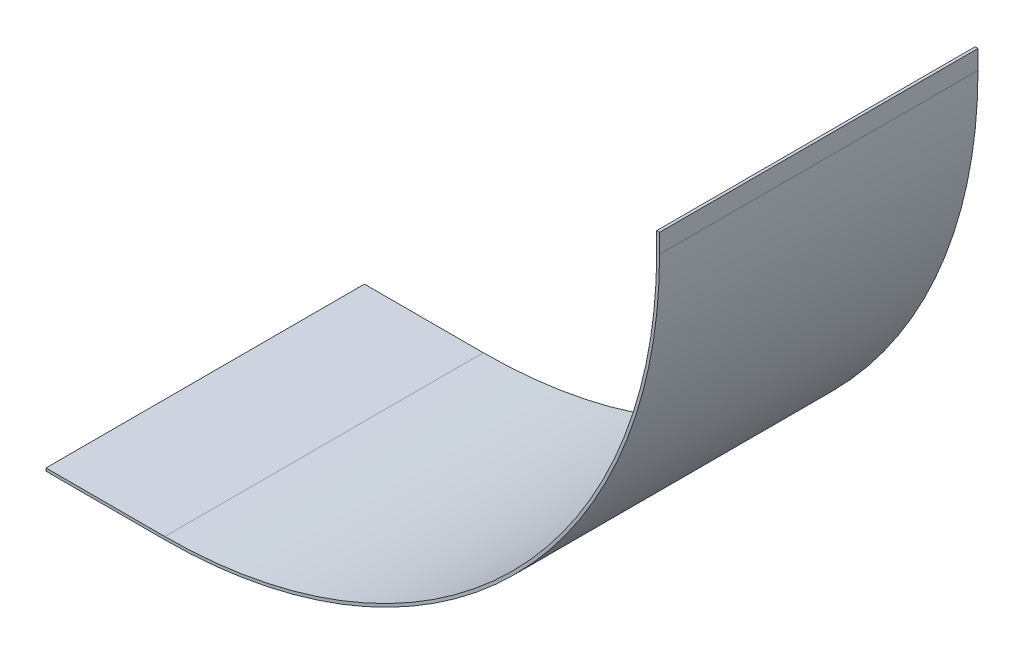
ISO-10303-21;
HEADER;
FILE_DESCRIPTION(('STEP AP214'),'2;1');
FILE_NAME('part.step','',(''),(''),'','','');
FILE_SCHEMA(('AUTOMOTIVE_DESIGN { 1 0 10303 214 1 1 1 1 }'));
ENDSEC;
DATA;
#1=APPLICATION_CONTEXT('core data for automotive mechanical design processes');
#2=APPLICATION_PROTOCOL_DEFINITION('international standard','automotive_design',2000,#1);
#3=PRODUCT_CONTEXT('',#1,'mechanical');
#4=PRODUCT('Part','Part','',(#3));
#5=PRODUCT_RELATED_PRODUCT_CATEGORY('part','',(#4));
#6=PRODUCT_DEFINITION_FORMATION('','',#4);
#7=PRODUCT_DEFINITION_CONTEXT('part definition',#1,'design');
#8=PRODUCT_DEFINITION('design','',#6,#7);
#9=PRODUCT_DEFINITION_SHAPE('','',#8);
#10=(LENGTH_UNIT() NAMED_UNIT(*) SI_UNIT(.MILLI.,.METRE.));
#11=(NAMED_UNIT(*) PLANE_ANGLE_UNIT() SI_UNIT($,.RADIAN.));
#12=(NAMED_UNIT(*) SI_UNIT($,.STERADIAN.) SOLID_ANGLE_UNIT());
#13=UNCERTAINTY_MEASURE_WITH_UNIT(LENGTH_MEASURE(1.E-05),#10,'distance_accuracy_value','');
#14=(GEOMETRIC_REPRESENTATION_CONTEXT(3) GLOBAL_UNCERTAINTY_ASSIGNED_CONTEXT((#13)) GLOBAL_UNIT_ASSIGNED_CONTEXT((#10,
#11,#12)) REPRESENTATION_CONTEXT('',''));
#15=CARTESIAN_POINT('',(0.,0.,0.));
#16=DIRECTION('',(0.,0.,1.));
#17=DIRECTION('',(1.,0.,0.));
#18=AXIS2_PLACEMENT_3D('',#15,#16,#17);
#19=CARTESIAN_POINT('',(1200.,-5485.,-670.));
#20=DIRECTION('',(0.,1.,0.));
#21=DIRECTION('',(0.,0.,1.));
#22=AXIS2_PLACEMENT_3D('',#19,#20,#21);
#23=PLANE('',#22);
#24=DIRECTION('',(-1.,0.,0.));
#25=VECTOR('',#24,1.);
#26=CARTESIAN_POINT('',(1200.,-5485.,0.));
#27=LINE('',#26,#25);
#28=CARTESIAN_POINT('',(1200.,-5485.,0.));
#29=VERTEX_POINT('',#28);
#30=CARTESIAN_POINT('',(950.000000000001,-5485.,0.));
#31=VERTEX_POINT('',#30);
#32=EDGE_CURVE('E132',#29,#31,#27,.T.);
#33=ORIENTED_EDGE('',*,*,#32,.F.);
#34=DIRECTION('',(0.,0.,1.));
#35=VECTOR('',#34,1.);
#36=CARTESIAN_POINT('',(1200.,-5485.,-670.));
#37=LINE('',#36,#35);
#38=CARTESIAN_POINT('',(1200.,-5485.,-670.));
#39=VERTEX_POINT('',#38);
#40=EDGE_CURVE('E11',#39,#29,#37,.T.);
#41=ORIENTED_EDGE('',*,*,#40,.F.);
#42=DIRECTION('',(-1.,0.,0.));
#43=VECTOR('',#42,1.);
#44=CARTESIAN_POINT('',(1200.,-5485.,-670.));
#45=LINE('',#44,#43);
#46=CARTESIAN_POINT('',(950.000000000001,-5485.,-670.));
#47=VERTEX_POINT('',#46);
#48=EDGE_CURVE('E149',#39,#47,#45,.T.);
#49=ORIENTED_EDGE('',*,*,#48,.T.);
#50=DIRECTION('',(0.,0.,1.));
#51=VECTOR('',#50,1.);
#52=CARTESIAN_POINT('',(950.000000000001,-5485.,-670.));
#53=LINE('',#52,#51);
#54=EDGE_CURVE('E42',#47,#31,#53,.T.);
#55=ORIENTED_EDGE('',*,*,#54,.T.);
#56=EDGE_LOOP('',(#33,#41,#49,#55));
#57=FACE_BOUND('',#56,.T.);
#58=ADVANCED_FACE('F39',(#57),#23,.T.);
#59=CARTESIAN_POINT('',(1200.,-4450.,-670.));
#60=DIRECTION('',(0.,0.,1.));
#61=DIRECTION('',(1.,0.,0.));
#62=AXIS2_PLACEMENT_3D('',#59,#60,#61);
#63=CYLINDRICAL_SURFACE('',#62,1035.);
#64=CARTESIAN_POINT('',(1200.,-4450.,0.));
#65=DIRECTION('',(0.,0.,-1.));
#66=DIRECTION('',(1.,0.,0.));
#67=AXIS2_PLACEMENT_3D('',#64,#65,#66);
#68=CIRCLE('',#67,1035.);
#69=CARTESIAN_POINT('',(2235.,-4450.,0.));
#70=VERTEX_POINT('',#69);
#71=EDGE_CURVE('E147',#70,#29,#68,.T.);
#72=ORIENTED_EDGE('',*,*,#71,.F.);
#73=DIRECTION('',(0.,0.,1.));
#74=VECTOR('',#73,1.);
#75=CARTESIAN_POINT('',(2235.,-4450.,-670.));
#76=LINE('',#75,#74);
#77=CARTESIAN_POINT('',(2235.,-4450.,-670.));
#78=VERTEX_POINT('',#77);
#79=EDGE_CURVE('E48',#78,#70,#76,.T.);
#80=ORIENTED_EDGE('',*,*,#79,.F.);
#81=CARTESIAN_POINT('',(1200.,-4450.,-670.));
#82=DIRECTION('',(0.,0.,-1.));
#83=DIRECTION('',(1.,0.,0.));
#84=AXIS2_PLACEMENT_3D('',#81,#82,#83);
#85=CIRCLE('',#84,1035.);
#86=EDGE_CURVE('E127',#78,#39,#85,.T.);
#87=ORIENTED_EDGE('',*,*,#86,.T.);
#88=ORIENTED_EDGE('',*,*,#40,.T.);
#89=EDGE_LOOP('',(#72,#80,#87,#88));
#90=FACE_BOUND('',#89,.T.);
#91=ADVANCED_FACE('F167',(#90),#63,.F.);
#92=CARTESIAN_POINT('',(2235.,-4410.,-670.));
#93=DIRECTION('',(-1.,0.,0.));
#94=DIRECTION('',(0.,0.,1.));
#95=AXIS2_PLACEMENT_3D('',#92,#93,#94);
#96=PLANE('',#95);
#97=DIRECTION('',(0.,-1.,0.));
#98=VECTOR('',#97,1.);
#99=CARTESIAN_POINT('',(2235.,-4410.,0.));
#100=LINE('',#99,#98);
#101=CARTESIAN_POINT('',(2235.,-4410.,0.));
#102=VERTEX_POINT('',#101);
#103=EDGE_CURVE('E114',#102,#70,#100,.T.);
#104=ORIENTED_EDGE('',*,*,#103,.F.);
#105=DIRECTION('',(0.,0.,1.));
#106=VECTOR('',#105,1.);
#107=CARTESIAN_POINT('',(2235.,-4410.,-670.));
#108=LINE('',#107,#106);
#109=CARTESIAN_POINT('',(2235.,-4410.,-670.));
#110=VERTEX_POINT('',#109);
#111=EDGE_CURVE('E108',#110,#102,#108,.T.);
#112=ORIENTED_EDGE('',*,*,#111,.F.);
#113=DIRECTION('',(0.,-1.,0.));
#114=VECTOR('',#113,1.);
#115=CARTESIAN_POINT('',(2235.,-4410.,-670.));
#116=LINE('',#115,#114);
#117=EDGE_CURVE('E112',#110,#78,#116,.T.);
#118=ORIENTED_EDGE('',*,*,#117,.T.);
#119=ORIENTED_EDGE('',*,*,#79,.T.);
#120=EDGE_LOOP('',(#104,#112,#118,#119));
#121=FACE_BOUND('',#120,.T.);
#122=ADVANCED_FACE('F110',(#121),#96,.T.);
#123=CARTESIAN_POINT('',(2235.,-4410.,-670.));
#124=DIRECTION('',(0.,-1.,0.));
#125=DIRECTION('',(0.,0.,-1.));
#126=AXIS2_PLACEMENT_3D('',#123,#124,#125);
#127=PLANE('',#126);
#128=DIRECTION('',(1.,0.,0.));
#129=VECTOR('',#128,1.);
#130=CARTESIAN_POINT('',(2235.,-4410.,0.));
#131=LINE('',#130,#129);
#132=CARTESIAN_POINT('',(2241.,-4410.,0.));
#133=VERTEX_POINT('',#132);
#134=EDGE_CURVE('E144',#102,#133,#131,.T.);
#135=ORIENTED_EDGE('',*,*,#134,.T.);
#136=DIRECTION('',(0.,0.,1.));
#137=VECTOR('',#136,1.);
#138=CARTESIAN_POINT('',(2241.,-4410.,-670.));
#139=LINE('',#138,#137);
#140=CARTESIAN_POINT('',(2241.,-4410.,-670.));
#141=VERTEX_POINT('',#140);
#142=EDGE_CURVE('E117',#141,#133,#139,.T.);
#143=ORIENTED_EDGE('',*,*,#142,.F.);
#144=DIRECTION('',(1.,0.,0.));
#145=VECTOR('',#144,1.);
#146=CARTESIAN_POINT('',(2235.,-4410.,-670.));
#147=LINE('',#146,#145);
#148=EDGE_CURVE('E120',#110,#141,#147,.T.);
#149=ORIENTED_EDGE('',*,*,#148,.F.);
#150=ORIENTED_EDGE('',*,*,#111,.T.);
#151=EDGE_LOOP('',(#135,#143,#149,#150));
#152=FACE_BOUND('',#151,.T.);
#153=ADVANCED_FACE('F121',(#152),#127,.F.);
#154=CARTESIAN_POINT('',(2241.,-4410.,-670.));
#155=DIRECTION('',(-1.,0.,0.));
#156=DIRECTION('',(0.,0.,1.));
#157=AXIS2_PLACEMENT_3D('',#154,#155,#156);
#158=PLANE('',#157);
#159=DIRECTION('',(0.,1.,0.));
#160=VECTOR('',#159,1.);
#161=CARTESIAN_POINT('',(2241.,-4410.,0.));
#162=LINE('',#161,#160);
#163=CARTESIAN_POINT('',(2241.,-4450.,0.));
#164=VERTEX_POINT('',#163);
#165=EDGE_CURVE('E142',#133,#164,#162,.F.);
#166=ORIENTED_EDGE('',*,*,#165,.T.);
#167=DIRECTION('',(0.,0.,1.));
#168=VECTOR('',#167,1.);
#169=CARTESIAN_POINT('',(2241.,-4450.,-670.));
#170=LINE('',#169,#168);
#171=CARTESIAN_POINT('',(2241.,-4450.,-670.));
#172=VERTEX_POINT('',#171);
#173=EDGE_CURVE('E153',#172,#164,#170,.T.);
#174=ORIENTED_EDGE('',*,*,#173,.F.);
#175=DIRECTION('',(0.,1.,0.));
#176=VECTOR('',#175,1.);
#177=CARTESIAN_POINT('',(2241.,-4410.,-670.));
#178=LINE('',#177,#176);
#179=EDGE_CURVE('E124',#141,#172,#178,.F.);
#180=ORIENTED_EDGE('',*,*,#179,.F.);
#181=ORIENTED_EDGE('',*,*,#142,.T.);
#182=EDGE_LOOP('',(#166,#174,#180,#181));
#183=FACE_BOUND('',#182,.T.);
#184=ADVANCED_FACE('F180',(#183),#158,.F.);
#185=CARTESIAN_POINT('',(1200.,-4450.,-670.));
#186=DIRECTION('',(0.,0.,1.));
#187=DIRECTION('',(1.,0.,0.));
#188=AXIS2_PLACEMENT_3D('',#185,#186,#187);
#189=CYLINDRICAL_SURFACE('',#188,1041.);
#190=CARTESIAN_POINT('',(1200.,-4450.,0.));
#191=DIRECTION('',(0.,0.,1.));
#192=DIRECTION('',(1.,0.,0.));
#193=AXIS2_PLACEMENT_3D('',#190,#191,#192);
#194=CIRCLE('',#193,1041.);
#195=CARTESIAN_POINT('',(1200.,-5491.,0.));
#196=VERTEX_POINT('',#195);
#197=EDGE_CURVE('E140',#164,#196,#194,.F.);
#198=ORIENTED_EDGE('',*,*,#197,.T.);
#199=DIRECTION('',(0.,0.,1.));
#200=VECTOR('',#199,1.);
#201=CARTESIAN_POINT('',(1200.,-5491.,-670.));
#202=LINE('',#201,#200);
#203=CARTESIAN_POINT('',(1200.,-5491.,-670.));
#204=VERTEX_POINT('',#203);
#205=EDGE_CURVE('E156',#204,#196,#202,.T.);
#206=ORIENTED_EDGE('',*,*,#205,.F.);
#207=CARTESIAN_POINT('',(1200.,-4450.,-670.));
#208=DIRECTION('',(0.,0.,1.));
#209=DIRECTION('',(1.,0.,0.));
#210=AXIS2_PLACEMENT_3D('',#207,#208,#209);
#211=CIRCLE('',#210,1041.);
#212=EDGE_CURVE('E258',#172,#204,#211,.F.);
#213=ORIENTED_EDGE('',*,*,#212,.F.);
#214=ORIENTED_EDGE('',*,*,#173,.T.);
#215=EDGE_LOOP('',(#198,#206,#213,#214));
#216=FACE_BOUND('',#215,.T.);
#217=ADVANCED_FACE('F183',(#216),#189,.T.);
#218=CARTESIAN_POINT('',(1200.,-5491.,-670.));
#219=DIRECTION('',(0.,1.,0.));
#220=DIRECTION('',(0.,0.,1.));
#221=AXIS2_PLACEMENT_3D('',#218,#219,#220);
#222=PLANE('',#221);
#223=DIRECTION('',(1.,0.,0.));
#224=VECTOR('',#223,1.);
#225=CARTESIAN_POINT('',(1200.,-5491.,0.));
#226=LINE('',#225,#224);
#227=CARTESIAN_POINT('',(950.000000000001,-5491.,0.));
#228=VERTEX_POINT('',#227);
#229=EDGE_CURVE('E138',#196,#228,#226,.F.);
#230=ORIENTED_EDGE('',*,*,#229,.T.);
#231=DIRECTION('',(0.,0.,1.));
#232=VECTOR('',#231,1.);
#233=CARTESIAN_POINT('',(950.000000000001,-5491.,-670.));
#234=LINE('',#233,#232);
#235=CARTESIAN_POINT('',(950.000000000001,-5491.,-670.));
#236=VERTEX_POINT('',#235);
#237=EDGE_CURVE('E158',#236,#228,#234,.T.);
#238=ORIENTED_EDGE('',*,*,#237,.F.);
#239=DIRECTION('',(1.,0.,0.));
#240=VECTOR('',#239,1.);
#241=CARTESIAN_POINT('',(1200.,-5491.,-670.));
#242=LINE('',#241,#240);
#243=EDGE_CURVE('E259',#204,#236,#242,.F.);
#244=ORIENTED_EDGE('',*,*,#243,.F.);
#245=ORIENTED_EDGE('',*,*,#205,.T.);
#246=EDGE_LOOP('',(#230,#238,#244,#245));
#247=FACE_BOUND('',#246,.T.);
#248=ADVANCED_FACE('F187',(#247),#222,.F.);
#249=CARTESIAN_POINT('',(950.000000000001,-5491.,-670.));
#250=DIRECTION('',(1.,0.,0.));
#251=DIRECTION('',(0.,0.,-1.));
#252=AXIS2_PLACEMENT_3D('',#249,#250,#251);
#253=PLANE('',#252);
#254=DIRECTION('',(0.,1.,0.));
#255=VECTOR('',#254,1.);
#256=CARTESIAN_POINT('',(950.000000000001,-5491.,0.));
#257=LINE('',#256,#255);
#258=EDGE_CURVE('E135',#228,#31,#257,.T.);
#259=ORIENTED_EDGE('',*,*,#258,.T.);
#260=ORIENTED_EDGE('',*,*,#54,.F.);
#261=DIRECTION('',(0.,1.,0.));
#262=VECTOR('',#261,1.);
#263=CARTESIAN_POINT('',(950.000000000001,-5491.,-670.));
#264=LINE('',#263,#262);
#265=EDGE_CURVE('E95',#236,#47,#264,.T.);
#266=ORIENTED_EDGE('',*,*,#265,.F.);
#267=ORIENTED_EDGE('',*,*,#237,.T.);
#268=EDGE_LOOP('',(#259,#260,#266,#267));
#269=FACE_BOUND('',#268,.T.);
#270=ADVANCED_FACE('F163',(#269),#253,.F.);
#271=CARTESIAN_POINT('',(1200.,-4450.,-670.));
#272=DIRECTION('',(0.,0.,1.));
#273=DIRECTION('',(1.,0.,0.));
#274=AXIS2_PLACEMENT_3D('',#271,#272,#273);
#275=PLANE('',#274);
#276=ORIENTED_EDGE('',*,*,#48,.F.);
#277=ORIENTED_EDGE('',*,*,#86,.F.);
#278=ORIENTED_EDGE('',*,*,#117,.F.);
#279=ORIENTED_EDGE('',*,*,#148,.T.);
#280=ORIENTED_EDGE('',*,*,#179,.T.);
#281=ORIENTED_EDGE('',*,*,#212,.T.);
#282=ORIENTED_EDGE('',*,*,#243,.T.);
#283=ORIENTED_EDGE('',*,*,#265,.T.);
#284=EDGE_LOOP('',(#276,#277,#278,#279,#280,#281,#282,#283));
#285=FACE_BOUND('',#284,.T.);
#286=ADVANCED_FACE('F126',(#285),#275,.F.);
#287=CARTESIAN_POINT('',(1200.,-4450.,0.));
#288=DIRECTION('',(0.,0.,1.));
#289=DIRECTION('',(1.,0.,0.));
#290=AXIS2_PLACEMENT_3D('',#287,#288,#289);
#291=PLANE('',#290);
#292=ORIENTED_EDGE('',*,*,#32,.T.);
#293=ORIENTED_EDGE('',*,*,#258,.F.);
#294=ORIENTED_EDGE('',*,*,#229,.F.);
#295=ORIENTED_EDGE('',*,*,#197,.F.);
#296=ORIENTED_EDGE('',*,*,#165,.F.);
#297=ORIENTED_EDGE('',*,*,#134,.F.);
#298=ORIENTED_EDGE('',*,*,#103,.T.);
#299=ORIENTED_EDGE('',*,*,#71,.T.);
#300=EDGE_LOOP('',(#292,#293,#294,#295,#296,#297,#298,#299));
#301=FACE_BOUND('',#300,.T.);
#302=ADVANCED_FACE('F166',(#301),#291,.T.);
#303=CLOSED_SHELL('',(#58,#91,#122,#153,#184,#217,#248,#270,#286,#302));
#304=MANIFOLD_SOLID_BREP('B2',#303);
#305=ADVANCED_BREP_SHAPE_REPRESENTATION('',(#18,#304),#14);
#306=SHAPE_DEFINITION_REPRESENTATION(#9,#305);
ENDSEC;
END-ISO-10303-21;
